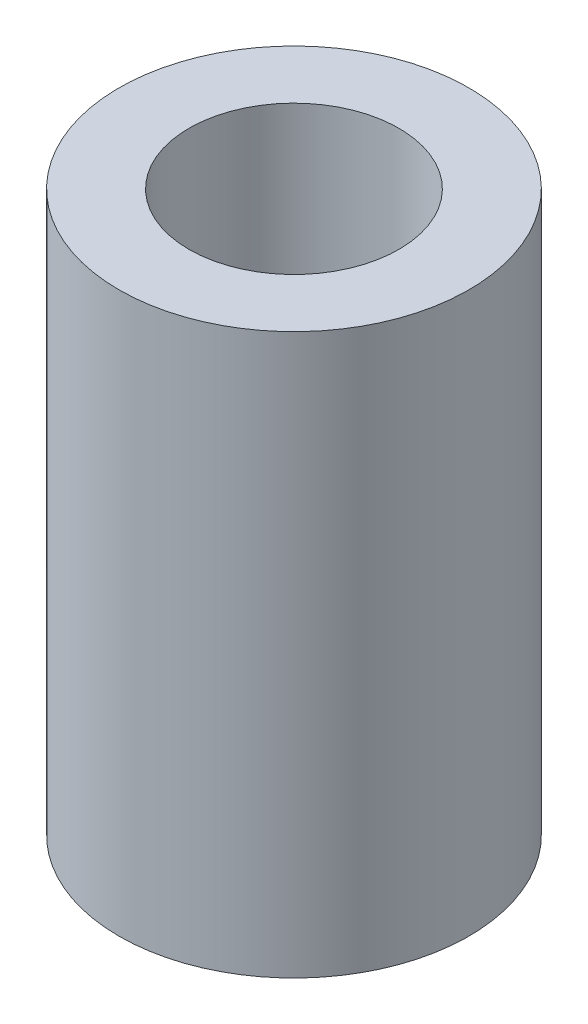
ISO-10303-21;
HEADER;
FILE_DESCRIPTION(('STEP AP214'),'2;1');
FILE_NAME('part.step','',(''),(''),'','','');
FILE_SCHEMA(('AUTOMOTIVE_DESIGN { 1 0 10303 214 1 1 1 1 }'));
ENDSEC;
DATA;
#1=APPLICATION_CONTEXT('core data for automotive mechanical design processes');
#2=APPLICATION_PROTOCOL_DEFINITION('international standard','automotive_design',2000,#1);
#3=PRODUCT_CONTEXT('',#1,'mechanical');
#4=PRODUCT('Part','Part','',(#3));
#5=PRODUCT_RELATED_PRODUCT_CATEGORY('part','',(#4));
#6=PRODUCT_DEFINITION_FORMATION('','',#4);
#7=PRODUCT_DEFINITION_CONTEXT('part definition',#1,'design');
#8=PRODUCT_DEFINITION('design','',#6,#7);
#9=PRODUCT_DEFINITION_SHAPE('','',#8);
#10=(LENGTH_UNIT() NAMED_UNIT(*) SI_UNIT(.MILLI.,.METRE.));
#11=(NAMED_UNIT(*) PLANE_ANGLE_UNIT() SI_UNIT($,.RADIAN.));
#12=(NAMED_UNIT(*) SI_UNIT($,.STERADIAN.) SOLID_ANGLE_UNIT());
#13=UNCERTAINTY_MEASURE_WITH_UNIT(LENGTH_MEASURE(1.E-05),#10,'distance_accuracy_value','');
#14=(GEOMETRIC_REPRESENTATION_CONTEXT(3) GLOBAL_UNCERTAINTY_ASSIGNED_CONTEXT((#13)) GLOBAL_UNIT_ASSIGNED_CONTEXT((#10,
#11,#12)) REPRESENTATION_CONTEXT('',''));
#15=CARTESIAN_POINT('',(0.,0.,0.));
#16=DIRECTION('',(0.,0.,1.));
#17=DIRECTION('',(1.,0.,0.));
#18=AXIS2_PLACEMENT_3D('',#15,#16,#17);
#19=CARTESIAN_POINT('',(0.,16.,0.));
#20=DIRECTION('',(0.,1.,0.));
#21=DIRECTION('',(0.,0.,1.));
#22=AXIS2_PLACEMENT_3D('',#19,#20,#21);
#23=PLANE('',#22);
#24=CARTESIAN_POINT('',(0.,16.,0.));
#25=DIRECTION('',(0.,1.,0.));
#26=DIRECTION('',(0.,0.,1.));
#27=AXIS2_PLACEMENT_3D('',#24,#25,#26);
#28=CIRCLE('',#27,5.);
#29=CARTESIAN_POINT('',(0.,16.,5.));
#30=VERTEX_POINT('',#29);
#31=EDGE_CURVE('E10',#30,#30,#28,.T.);
#32=ORIENTED_EDGE('',*,*,#31,.T.);
#33=EDGE_LOOP('',(#32));
#34=FACE_BOUND('',#33,.T.);
#35=CARTESIAN_POINT('',(0.,16.,0.));
#36=DIRECTION('',(0.,1.,0.));
#37=DIRECTION('',(0.,0.,1.));
#38=AXIS2_PLACEMENT_3D('',#35,#36,#37);
#39=CIRCLE('',#38,3.);
#40=CARTESIAN_POINT('',(0.,16.,3.));
#41=VERTEX_POINT('',#40);
#42=EDGE_CURVE('E41',#41,#41,#39,.T.);
#43=ORIENTED_EDGE('',*,*,#42,.F.);
#44=EDGE_LOOP('',(#43));
#45=FACE_BOUND('',#44,.T.);
#46=ADVANCED_FACE('F30',(#34,#45),#23,.T.);
#47=CARTESIAN_POINT('',(0.,0.,0.));
#48=DIRECTION('',(0.,1.,0.));
#49=DIRECTION('',(0.,0.,1.));
#50=AXIS2_PLACEMENT_3D('',#47,#48,#49);
#51=PLANE('',#50);
#52=CARTESIAN_POINT('',(0.,0.,0.));
#53=DIRECTION('',(0.,1.,0.));
#54=DIRECTION('',(0.,0.,1.));
#55=AXIS2_PLACEMENT_3D('',#52,#53,#54);
#56=CIRCLE('',#55,5.);
#57=CARTESIAN_POINT('',(0.,0.,5.));
#58=VERTEX_POINT('',#57);
#59=EDGE_CURVE('E34',#58,#58,#56,.T.);
#60=ORIENTED_EDGE('',*,*,#59,.F.);
#61=EDGE_LOOP('',(#60));
#62=FACE_BOUND('',#61,.T.);
#63=CARTESIAN_POINT('',(0.,0.,0.));
#64=DIRECTION('',(0.,1.,0.));
#65=DIRECTION('',(0.,0.,1.));
#66=AXIS2_PLACEMENT_3D('',#63,#64,#65);
#67=CIRCLE('',#66,3.);
#68=CARTESIAN_POINT('',(0.,0.,3.));
#69=VERTEX_POINT('',#68);
#70=EDGE_CURVE('E43',#69,#69,#67,.T.);
#71=ORIENTED_EDGE('',*,*,#70,.T.);
#72=EDGE_LOOP('',(#71));
#73=FACE_BOUND('',#72,.T.);
#74=ADVANCED_FACE('F53',(#62,#73),#51,.F.);
#75=CARTESIAN_POINT('',(0.,16.,0.));
#76=DIRECTION('',(0.,-1.,0.));
#77=DIRECTION('',(0.,0.,-1.));
#78=AXIS2_PLACEMENT_3D('',#75,#76,#77);
#79=CYLINDRICAL_SURFACE('',#78,5.);
#80=ORIENTED_EDGE('',*,*,#31,.F.);
#81=EDGE_LOOP('',(#80));
#82=FACE_BOUND('',#81,.T.);
#83=ORIENTED_EDGE('',*,*,#59,.T.);
#84=EDGE_LOOP('',(#83));
#85=FACE_BOUND('',#84,.T.);
#86=ADVANCED_FACE('F32',(#82,#85),#79,.T.);
#87=CARTESIAN_POINT('',(0.,16.,0.));
#88=DIRECTION('',(0.,-1.,0.));
#89=DIRECTION('',(0.,0.,-1.));
#90=AXIS2_PLACEMENT_3D('',#87,#88,#89);
#91=CYLINDRICAL_SURFACE('',#90,3.);
#92=ORIENTED_EDGE('',*,*,#42,.T.);
#93=EDGE_LOOP('',(#92));
#94=FACE_BOUND('',#93,.T.);
#95=ORIENTED_EDGE('',*,*,#70,.F.);
#96=EDGE_LOOP('',(#95));
#97=FACE_BOUND('',#96,.T.);
#98=ADVANCED_FACE('F49',(#94,#97),#91,.F.);
#99=CLOSED_SHELL('',(#46,#74,#86,#98));
#100=MANIFOLD_SOLID_BREP('B2',#99);
#101=ADVANCED_BREP_SHAPE_REPRESENTATION('',(#18,#100),#14);
#102=SHAPE_DEFINITION_REPRESENTATION(#9,#101);
ENDSEC;
END-ISO-10303-21;
